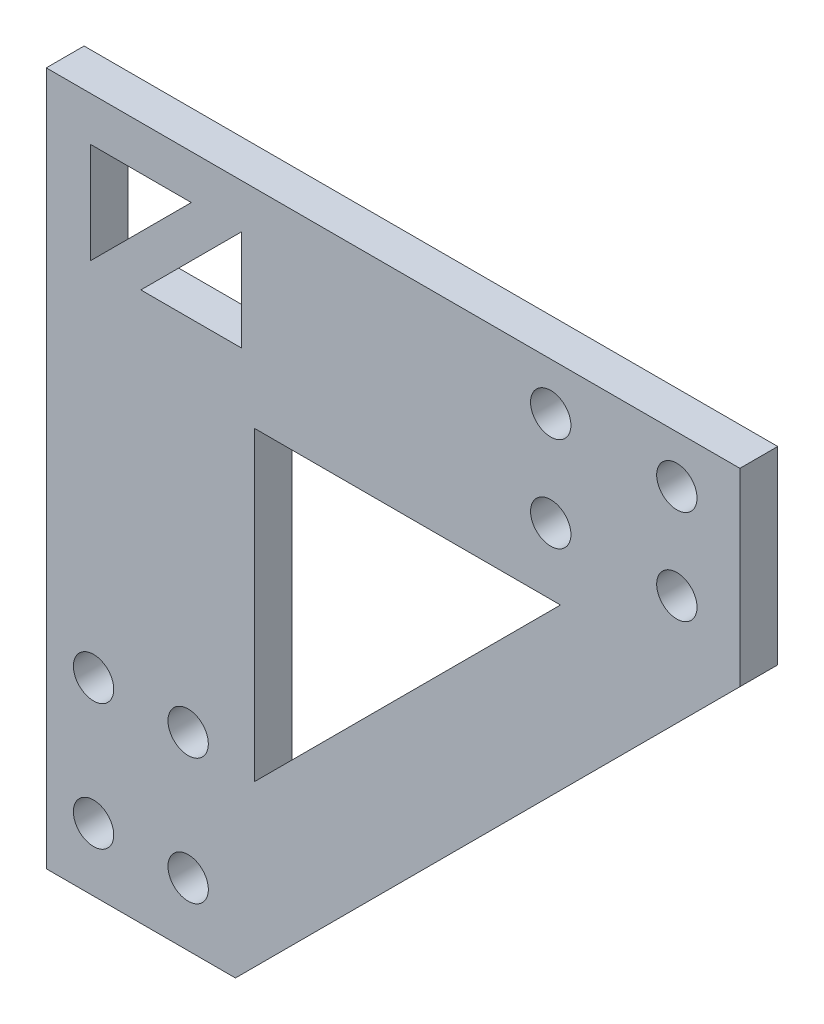
ISO-10303-21;
HEADER;
FILE_DESCRIPTION(('STEP AP214'),'2;1');
FILE_NAME('part.step','',(''),(''),'','','');
FILE_SCHEMA(('AUTOMOTIVE_DESIGN { 1 0 10303 214 1 1 1 1 }'));
ENDSEC;
DATA;
#1=APPLICATION_CONTEXT('core data for automotive mechanical design processes');
#2=APPLICATION_PROTOCOL_DEFINITION('international standard','automotive_design',2000,#1);
#3=PRODUCT_CONTEXT('',#1,'mechanical');
#4=PRODUCT('Part','Part','',(#3));
#5=PRODUCT_RELATED_PRODUCT_CATEGORY('part','',(#4));
#6=PRODUCT_DEFINITION_FORMATION('','',#4);
#7=PRODUCT_DEFINITION_CONTEXT('part definition',#1,'design');
#8=PRODUCT_DEFINITION('design','',#6,#7);
#9=PRODUCT_DEFINITION_SHAPE('','',#8);
#10=(LENGTH_UNIT() NAMED_UNIT(*) SI_UNIT(.MILLI.,.METRE.));
#11=(NAMED_UNIT(*) PLANE_ANGLE_UNIT() SI_UNIT($,.RADIAN.));
#12=(NAMED_UNIT(*) SI_UNIT($,.STERADIAN.) SOLID_ANGLE_UNIT());
#13=UNCERTAINTY_MEASURE_WITH_UNIT(LENGTH_MEASURE(1.E-05),#10,'distance_accuracy_value','');
#14=(GEOMETRIC_REPRESENTATION_CONTEXT(3) GLOBAL_UNCERTAINTY_ASSIGNED_CONTEXT((#13)) GLOBAL_UNIT_ASSIGNED_CONTEXT((#10,
#11,#12)) REPRESENTATION_CONTEXT('',''));
#15=CARTESIAN_POINT('',(0.,0.,0.));
#16=DIRECTION('',(0.,0.,1.));
#17=DIRECTION('',(1.,0.,0.));
#18=AXIS2_PLACEMENT_3D('',#15,#16,#17);
#19=CARTESIAN_POINT('',(0.,0.,3.));
#20=DIRECTION('',(0.,0.,-1.));
#21=DIRECTION('',(-1.,0.,0.));
#22=AXIS2_PLACEMENT_3D('',#19,#20,#21);
#23=PLANE('',#22);
#24=DIRECTION('',(0.,-1.,0.));
#25=VECTOR('',#24,1.);
#26=CARTESIAN_POINT('',(3.49999999999999,-3.5,3.));
#27=LINE('',#26,#25);
#28=CARTESIAN_POINT('',(3.49999999999999,-3.5,3.));
#29=VERTEX_POINT('',#28);
#30=CARTESIAN_POINT('',(3.5,-11.5,3.));
#31=VERTEX_POINT('',#30);
#32=EDGE_CURVE('E181',#29,#31,#27,.T.);
#33=ORIENTED_EDGE('',*,*,#32,.F.);
#34=DIRECTION('',(-1.,0.,0.));
#35=VECTOR('',#34,1.);
#36=CARTESIAN_POINT('',(3.49999999999999,-3.5,3.));
#37=LINE('',#36,#35);
#38=CARTESIAN_POINT('',(11.5,-3.5,3.));
#39=VERTEX_POINT('',#38);
#40=EDGE_CURVE('E189',#39,#29,#37,.T.);
#41=ORIENTED_EDGE('',*,*,#40,.F.);
#42=DIRECTION('',(0.707106781186547,0.707106781186548,0.));
#43=VECTOR('',#42,1.);
#44=CARTESIAN_POINT('',(11.5,-3.5,3.));
#45=LINE('',#44,#43);
#46=EDGE_CURVE('E184',#31,#39,#45,.T.);
#47=ORIENTED_EDGE('',*,*,#46,.F.);
#48=EDGE_LOOP('',(#33,#41,#47));
#49=FACE_BOUND('',#48,.T.);
#50=CARTESIAN_POINT('',(40.,-3.75,3.));
#51=DIRECTION('',(0.,0.,1.));
#52=DIRECTION('',(-1.,0.,0.));
#53=AXIS2_PLACEMENT_3D('',#50,#51,#52);
#54=CIRCLE('',#53,1.6);
#55=CARTESIAN_POINT('',(38.4,-3.75,3.));
#56=VERTEX_POINT('',#55);
#57=EDGE_CURVE('E247',#56,#56,#54,.T.);
#58=ORIENTED_EDGE('',*,*,#57,.F.);
#59=EDGE_LOOP('',(#58));
#60=FACE_BOUND('',#59,.T.);
#61=CARTESIAN_POINT('',(40.,-11.25,3.));
#62=DIRECTION('',(0.,0.,1.));
#63=DIRECTION('',(1.,0.,0.));
#64=AXIS2_PLACEMENT_3D('',#61,#62,#63);
#65=CIRCLE('',#64,1.6);
#66=CARTESIAN_POINT('',(41.6,-11.25,3.));
#67=VERTEX_POINT('',#66);
#68=EDGE_CURVE('E255',#67,#67,#65,.T.);
#69=ORIENTED_EDGE('',*,*,#68,.F.);
#70=EDGE_LOOP('',(#69));
#71=FACE_BOUND('',#70,.T.);
#72=CARTESIAN_POINT('',(50.,-11.25,3.));
#73=DIRECTION('',(0.,0.,1.));
#74=DIRECTION('',(-1.,0.,0.));
#75=AXIS2_PLACEMENT_3D('',#72,#73,#74);
#76=CIRCLE('',#75,1.6);
#77=CARTESIAN_POINT('',(48.4,-11.25,3.));
#78=VERTEX_POINT('',#77);
#79=EDGE_CURVE('E263',#78,#78,#76,.T.);
#80=ORIENTED_EDGE('',*,*,#79,.F.);
#81=EDGE_LOOP('',(#80));
#82=FACE_BOUND('',#81,.T.);
#83=CARTESIAN_POINT('',(50.,-3.75,3.));
#84=DIRECTION('',(0.,0.,1.));
#85=DIRECTION('',(1.,0.,0.));
#86=AXIS2_PLACEMENT_3D('',#83,#84,#85);
#87=CIRCLE('',#86,1.6);
#88=CARTESIAN_POINT('',(51.6,-3.75,3.));
#89=VERTEX_POINT('',#88);
#90=EDGE_CURVE('E271',#89,#89,#87,.T.);
#91=ORIENTED_EDGE('',*,*,#90,.F.);
#92=EDGE_LOOP('',(#91));
#93=FACE_BOUND('',#92,.T.);
#94=CARTESIAN_POINT('',(3.75000000000001,-40.,3.));
#95=DIRECTION('',(0.,0.,1.));
#96=DIRECTION('',(-1.,0.,0.));
#97=AXIS2_PLACEMENT_3D('',#94,#95,#96);
#98=CIRCLE('',#97,1.6);
#99=CARTESIAN_POINT('',(2.15000000000002,-40.,3.));
#100=VERTEX_POINT('',#99);
#101=EDGE_CURVE('E279',#100,#100,#98,.T.);
#102=ORIENTED_EDGE('',*,*,#101,.F.);
#103=EDGE_LOOP('',(#102));
#104=FACE_BOUND('',#103,.T.);
#105=CARTESIAN_POINT('',(11.25,-40.,3.));
#106=DIRECTION('',(0.,0.,1.));
#107=DIRECTION('',(1.,0.,0.));
#108=AXIS2_PLACEMENT_3D('',#105,#106,#107);
#109=CIRCLE('',#108,1.6);
#110=CARTESIAN_POINT('',(12.85,-40.,3.));
#111=VERTEX_POINT('',#110);
#112=EDGE_CURVE('E287',#111,#111,#109,.T.);
#113=ORIENTED_EDGE('',*,*,#112,.F.);
#114=EDGE_LOOP('',(#113));
#115=FACE_BOUND('',#114,.T.);
#116=CARTESIAN_POINT('',(11.25,-50.,3.));
#117=DIRECTION('',(0.,0.,1.));
#118=DIRECTION('',(-1.,0.,0.));
#119=AXIS2_PLACEMENT_3D('',#116,#117,#118);
#120=CIRCLE('',#119,1.6);
#121=CARTESIAN_POINT('',(9.65000000000002,-50.,3.));
#122=VERTEX_POINT('',#121);
#123=EDGE_CURVE('E295',#122,#122,#120,.T.);
#124=ORIENTED_EDGE('',*,*,#123,.F.);
#125=EDGE_LOOP('',(#124));
#126=FACE_BOUND('',#125,.T.);
#127=CARTESIAN_POINT('',(3.75000000000001,-50.,3.));
#128=DIRECTION('',(0.,0.,1.));
#129=DIRECTION('',(1.,0.,0.));
#130=AXIS2_PLACEMENT_3D('',#127,#128,#129);
#131=CIRCLE('',#130,1.6);
#132=CARTESIAN_POINT('',(5.35000000000001,-50.,3.));
#133=VERTEX_POINT('',#132);
#134=EDGE_CURVE('E303',#133,#133,#131,.T.);
#135=ORIENTED_EDGE('',*,*,#134,.F.);
#136=EDGE_LOOP('',(#135));
#137=FACE_BOUND('',#136,.T.);
#138=DIRECTION('',(0.,-1.,0.));
#139=VECTOR('',#138,1.);
#140=CARTESIAN_POINT('',(0.,-55.,3.));
#141=LINE('',#140,#139);
#142=CARTESIAN_POINT('',(0.,0.,3.));
#143=VERTEX_POINT('',#142);
#144=CARTESIAN_POINT('',(0.,-55.,3.));
#145=VERTEX_POINT('',#144);
#146=EDGE_CURVE('E311',#143,#145,#141,.T.);
#147=ORIENTED_EDGE('',*,*,#146,.T.);
#148=DIRECTION('',(1.,0.,0.));
#149=VECTOR('',#148,1.);
#150=CARTESIAN_POINT('',(15.,-55.,3.));
#151=LINE('',#150,#149);
#152=CARTESIAN_POINT('',(15.,-55.,3.));
#153=VERTEX_POINT('',#152);
#154=EDGE_CURVE('E315',#145,#153,#151,.T.);
#155=ORIENTED_EDGE('',*,*,#154,.T.);
#156=DIRECTION('',(0.707106781186547,0.707106781186548,0.));
#157=VECTOR('',#156,1.);
#158=CARTESIAN_POINT('',(55.,-15.,3.));
#159=LINE('',#158,#157);
#160=CARTESIAN_POINT('',(55.,-15.,3.));
#161=VERTEX_POINT('',#160);
#162=EDGE_CURVE('E319',#153,#161,#159,.T.);
#163=ORIENTED_EDGE('',*,*,#162,.T.);
#164=DIRECTION('',(0.,1.,0.));
#165=VECTOR('',#164,1.);
#166=CARTESIAN_POINT('',(55.,0.,3.));
#167=LINE('',#166,#165);
#168=CARTESIAN_POINT('',(55.,0.,3.));
#169=VERTEX_POINT('',#168);
#170=EDGE_CURVE('E322',#161,#169,#167,.T.);
#171=ORIENTED_EDGE('',*,*,#170,.T.);
#172=DIRECTION('',(-1.,0.,0.));
#173=VECTOR('',#172,1.);
#174=CARTESIAN_POINT('',(0.,0.,3.));
#175=LINE('',#174,#173);
#176=EDGE_CURVE('E325',#169,#143,#175,.T.);
#177=ORIENTED_EDGE('',*,*,#176,.T.);
#178=EDGE_LOOP('',(#147,#155,#163,#171,#177));
#179=FACE_BOUND('',#178,.T.);
#180=DIRECTION('',(-1.,0.,0.));
#181=VECTOR('',#180,1.);
#182=CARTESIAN_POINT('',(40.7720779386421,-16.5,3.));
#183=LINE('',#182,#181);
#184=CARTESIAN_POINT('',(40.7720779386421,-16.5,3.));
#185=VERTEX_POINT('',#184);
#186=CARTESIAN_POINT('',(16.5,-16.5,3.));
#187=VERTEX_POINT('',#186);
#188=EDGE_CURVE('E214',#185,#187,#183,.T.);
#189=ORIENTED_EDGE('',*,*,#188,.F.);
#190=DIRECTION('',(0.707106781186547,0.707106781186548,0.));
#191=VECTOR('',#190,1.);
#192=CARTESIAN_POINT('',(16.5,-40.7720779386422,3.));
#193=LINE('',#192,#191);
#194=CARTESIAN_POINT('',(16.5,-40.7720779386422,3.));
#195=VERTEX_POINT('',#194);
#196=EDGE_CURVE('E222',#195,#185,#193,.T.);
#197=ORIENTED_EDGE('',*,*,#196,.F.);
#198=DIRECTION('',(0.,-1.,0.));
#199=VECTOR('',#198,1.);
#200=CARTESIAN_POINT('',(16.5,-16.5,3.));
#201=LINE('',#200,#199);
#202=EDGE_CURVE('E217',#187,#195,#201,.T.);
#203=ORIENTED_EDGE('',*,*,#202,.F.);
#204=EDGE_LOOP('',(#189,#197,#203));
#205=FACE_BOUND('',#204,.T.);
#206=DIRECTION('',(0.,1.,0.));
#207=VECTOR('',#206,1.);
#208=CARTESIAN_POINT('',(15.5,-11.5,3.));
#209=LINE('',#208,#207);
#210=CARTESIAN_POINT('',(15.5,-11.5,3.));
#211=VERTEX_POINT('',#210);
#212=CARTESIAN_POINT('',(15.5,-3.5,3.));
#213=VERTEX_POINT('',#212);
#214=EDGE_CURVE('E145',#211,#213,#209,.T.);
#215=ORIENTED_EDGE('',*,*,#214,.F.);
#216=DIRECTION('',(1.,0.,0.));
#217=VECTOR('',#216,1.);
#218=CARTESIAN_POINT('',(7.5,-11.5,3.));
#219=LINE('',#218,#217);
#220=CARTESIAN_POINT('',(7.5,-11.5,3.));
#221=VERTEX_POINT('',#220);
#222=EDGE_CURVE('E164',#221,#211,#219,.T.);
#223=ORIENTED_EDGE('',*,*,#222,.F.);
#224=DIRECTION('',(-0.707106781186547,-0.707106781186548,0.));
#225=VECTOR('',#224,1.);
#226=CARTESIAN_POINT('',(15.5,-3.5,3.));
#227=LINE('',#226,#225);
#228=EDGE_CURVE('E154',#213,#221,#227,.T.);
#229=ORIENTED_EDGE('',*,*,#228,.F.);
#230=EDGE_LOOP('',(#215,#223,#229));
#231=FACE_BOUND('',#230,.T.);
#232=ADVANCED_FACE('F43',(#49,#60,#71,#82,#93,#104,#115,#126,#137,#179,#205,#231),#23,.F.);
#233=CARTESIAN_POINT('',(0.,0.,0.));
#234=DIRECTION('',(0.,0.,-1.));
#235=DIRECTION('',(-1.,0.,0.));
#236=AXIS2_PLACEMENT_3D('',#233,#234,#235);
#237=PLANE('',#236);
#238=CARTESIAN_POINT('',(40.,-11.25,0.));
#239=DIRECTION('',(0.,0.,1.));
#240=DIRECTION('',(1.,0.,0.));
#241=AXIS2_PLACEMENT_3D('',#238,#239,#240);
#242=CIRCLE('',#241,1.6);
#243=CARTESIAN_POINT('',(41.6,-11.25,0.));
#244=VERTEX_POINT('',#243);
#245=EDGE_CURVE('E251',#244,#244,#242,.T.);
#246=ORIENTED_EDGE('',*,*,#245,.T.);
#247=EDGE_LOOP('',(#246));
#248=FACE_BOUND('',#247,.T.);
#249=CARTESIAN_POINT('',(50.,-3.75,0.));
#250=DIRECTION('',(0.,0.,1.));
#251=DIRECTION('',(1.,0.,0.));
#252=AXIS2_PLACEMENT_3D('',#249,#250,#251);
#253=CIRCLE('',#252,1.6);
#254=CARTESIAN_POINT('',(51.6,-3.75,0.));
#255=VERTEX_POINT('',#254);
#256=EDGE_CURVE('E267',#255,#255,#253,.T.);
#257=ORIENTED_EDGE('',*,*,#256,.T.);
#258=EDGE_LOOP('',(#257));
#259=FACE_BOUND('',#258,.T.);
#260=CARTESIAN_POINT('',(11.25,-40.,0.));
#261=DIRECTION('',(0.,0.,1.));
#262=DIRECTION('',(1.,0.,0.));
#263=AXIS2_PLACEMENT_3D('',#260,#261,#262);
#264=CIRCLE('',#263,1.6);
#265=CARTESIAN_POINT('',(12.85,-40.,0.));
#266=VERTEX_POINT('',#265);
#267=EDGE_CURVE('E283',#266,#266,#264,.T.);
#268=ORIENTED_EDGE('',*,*,#267,.T.);
#269=EDGE_LOOP('',(#268));
#270=FACE_BOUND('',#269,.T.);
#271=CARTESIAN_POINT('',(3.75000000000001,-50.,0.));
#272=DIRECTION('',(0.,0.,1.));
#273=DIRECTION('',(1.,0.,0.));
#274=AXIS2_PLACEMENT_3D('',#271,#272,#273);
#275=CIRCLE('',#274,1.6);
#276=CARTESIAN_POINT('',(5.35000000000001,-50.,0.));
#277=VERTEX_POINT('',#276);
#278=EDGE_CURVE('E299',#277,#277,#275,.T.);
#279=ORIENTED_EDGE('',*,*,#278,.T.);
#280=EDGE_LOOP('',(#279));
#281=FACE_BOUND('',#280,.T.);
#282=DIRECTION('',(0.,-1.,0.));
#283=VECTOR('',#282,1.);
#284=CARTESIAN_POINT('',(0.,-55.,0.));
#285=LINE('',#284,#283);
#286=CARTESIAN_POINT('',(0.,0.,0.));
#287=VERTEX_POINT('',#286);
#288=CARTESIAN_POINT('',(0.,-55.,0.));
#289=VERTEX_POINT('',#288);
#290=EDGE_CURVE('E307',#287,#289,#285,.T.);
#291=ORIENTED_EDGE('',*,*,#290,.F.);
#292=DIRECTION('',(-1.,0.,0.));
#293=VECTOR('',#292,1.);
#294=CARTESIAN_POINT('',(0.,0.,0.));
#295=LINE('',#294,#293);
#296=CARTESIAN_POINT('',(55.,0.,0.));
#297=VERTEX_POINT('',#296);
#298=EDGE_CURVE('E316',#297,#287,#295,.T.);
#299=ORIENTED_EDGE('',*,*,#298,.F.);
#300=DIRECTION('',(0.,1.,0.));
#301=VECTOR('',#300,1.);
#302=CARTESIAN_POINT('',(55.,0.,0.));
#303=LINE('',#302,#301);
#304=CARTESIAN_POINT('',(55.,-15.,0.));
#305=VERTEX_POINT('',#304);
#306=EDGE_CURVE('E338',#305,#297,#303,.T.);
#307=ORIENTED_EDGE('',*,*,#306,.F.);
#308=DIRECTION('',(0.707106781186547,0.707106781186548,0.));
#309=VECTOR('',#308,1.);
#310=CARTESIAN_POINT('',(55.,-15.,0.));
#311=LINE('',#310,#309);
#312=CARTESIAN_POINT('',(15.,-55.,0.));
#313=VERTEX_POINT('',#312);
#314=EDGE_CURVE('E335',#313,#305,#311,.T.);
#315=ORIENTED_EDGE('',*,*,#314,.F.);
#316=DIRECTION('',(1.,0.,0.));
#317=VECTOR('',#316,1.);
#318=CARTESIAN_POINT('',(15.,-55.,0.));
#319=LINE('',#318,#317);
#320=EDGE_CURVE('E332',#289,#313,#319,.T.);
#321=ORIENTED_EDGE('',*,*,#320,.F.);
#322=EDGE_LOOP('',(#291,#299,#307,#315,#321));
#323=FACE_BOUND('',#322,.T.);
#324=CARTESIAN_POINT('',(11.25,-50.,0.));
#325=DIRECTION('',(0.,0.,1.));
#326=DIRECTION('',(-1.,0.,0.));
#327=AXIS2_PLACEMENT_3D('',#324,#325,#326);
#328=CIRCLE('',#327,1.6);
#329=CARTESIAN_POINT('',(9.65000000000002,-50.,0.));
#330=VERTEX_POINT('',#329);
#331=EDGE_CURVE('E291',#330,#330,#328,.T.);
#332=ORIENTED_EDGE('',*,*,#331,.T.);
#333=EDGE_LOOP('',(#332));
#334=FACE_BOUND('',#333,.T.);
#335=CARTESIAN_POINT('',(3.75000000000001,-40.,0.));
#336=DIRECTION('',(0.,0.,1.));
#337=DIRECTION('',(-1.,0.,0.));
#338=AXIS2_PLACEMENT_3D('',#335,#336,#337);
#339=CIRCLE('',#338,1.6);
#340=CARTESIAN_POINT('',(2.15000000000002,-40.,0.));
#341=VERTEX_POINT('',#340);
#342=EDGE_CURVE('E275',#341,#341,#339,.T.);
#343=ORIENTED_EDGE('',*,*,#342,.T.);
#344=EDGE_LOOP('',(#343));
#345=FACE_BOUND('',#344,.T.);
#346=CARTESIAN_POINT('',(50.,-11.25,0.));
#347=DIRECTION('',(0.,0.,1.));
#348=DIRECTION('',(-1.,0.,0.));
#349=AXIS2_PLACEMENT_3D('',#346,#347,#348);
#350=CIRCLE('',#349,1.6);
#351=CARTESIAN_POINT('',(48.4,-11.25,0.));
#352=VERTEX_POINT('',#351);
#353=EDGE_CURVE('E259',#352,#352,#350,.T.);
#354=ORIENTED_EDGE('',*,*,#353,.T.);
#355=EDGE_LOOP('',(#354));
#356=FACE_BOUND('',#355,.T.);
#357=CARTESIAN_POINT('',(40.,-3.75,0.));
#358=DIRECTION('',(0.,0.,1.));
#359=DIRECTION('',(-1.,0.,0.));
#360=AXIS2_PLACEMENT_3D('',#357,#358,#359);
#361=CIRCLE('',#360,1.6);
#362=CARTESIAN_POINT('',(38.4,-3.75,0.));
#363=VERTEX_POINT('',#362);
#364=EDGE_CURVE('E246',#363,#363,#361,.T.);
#365=ORIENTED_EDGE('',*,*,#364,.T.);
#366=EDGE_LOOP('',(#365));
#367=FACE_BOUND('',#366,.T.);
#368=DIRECTION('',(0.707106781186547,0.707106781186548,0.));
#369=VECTOR('',#368,1.);
#370=CARTESIAN_POINT('',(16.5,-40.7720779386422,0.));
#371=LINE('',#370,#369);
#372=CARTESIAN_POINT('',(16.5,-40.7720779386422,0.));
#373=VERTEX_POINT('',#372);
#374=CARTESIAN_POINT('',(40.7720779386421,-16.5,0.));
#375=VERTEX_POINT('',#374);
#376=EDGE_CURVE('E218',#373,#375,#371,.T.);
#377=ORIENTED_EDGE('',*,*,#376,.T.);
#378=DIRECTION('',(-1.,0.,0.));
#379=VECTOR('',#378,1.);
#380=CARTESIAN_POINT('',(40.7720779386421,-16.5,0.));
#381=LINE('',#380,#379);
#382=CARTESIAN_POINT('',(16.5,-16.5,0.));
#383=VERTEX_POINT('',#382);
#384=EDGE_CURVE('E213',#375,#383,#381,.T.);
#385=ORIENTED_EDGE('',*,*,#384,.T.);
#386=DIRECTION('',(0.,-1.,0.));
#387=VECTOR('',#386,1.);
#388=CARTESIAN_POINT('',(16.5,-16.5,0.));
#389=LINE('',#388,#387);
#390=EDGE_CURVE('E229',#383,#373,#389,.T.);
#391=ORIENTED_EDGE('',*,*,#390,.T.);
#392=EDGE_LOOP('',(#377,#385,#391));
#393=FACE_BOUND('',#392,.T.);
#394=DIRECTION('',(-1.,0.,0.));
#395=VECTOR('',#394,1.);
#396=CARTESIAN_POINT('',(3.49999999999999,-3.5,0.));
#397=LINE('',#396,#395);
#398=CARTESIAN_POINT('',(11.5,-3.5,0.));
#399=VERTEX_POINT('',#398);
#400=CARTESIAN_POINT('',(3.49999999999999,-3.5,0.));
#401=VERTEX_POINT('',#400);
#402=EDGE_CURVE('E185',#399,#401,#397,.T.);
#403=ORIENTED_EDGE('',*,*,#402,.T.);
#404=DIRECTION('',(0.,-1.,0.));
#405=VECTOR('',#404,1.);
#406=CARTESIAN_POINT('',(3.49999999999999,-3.5,0.));
#407=LINE('',#406,#405);
#408=CARTESIAN_POINT('',(3.5,-11.5,0.));
#409=VERTEX_POINT('',#408);
#410=EDGE_CURVE('E162',#401,#409,#407,.T.);
#411=ORIENTED_EDGE('',*,*,#410,.T.);
#412=DIRECTION('',(0.707106781186547,0.707106781186548,0.));
#413=VECTOR('',#412,1.);
#414=CARTESIAN_POINT('',(11.5,-3.5,0.));
#415=LINE('',#414,#413);
#416=EDGE_CURVE('E196',#409,#399,#415,.T.);
#417=ORIENTED_EDGE('',*,*,#416,.T.);
#418=EDGE_LOOP('',(#403,#411,#417));
#419=FACE_BOUND('',#418,.T.);
#420=DIRECTION('',(1.,0.,0.));
#421=VECTOR('',#420,1.);
#422=CARTESIAN_POINT('',(7.5,-11.5,0.));
#423=LINE('',#422,#421);
#424=CARTESIAN_POINT('',(7.5,-11.5,0.));
#425=VERTEX_POINT('',#424);
#426=CARTESIAN_POINT('',(15.5,-11.5,0.));
#427=VERTEX_POINT('',#426);
#428=EDGE_CURVE('E155',#425,#427,#423,.T.);
#429=ORIENTED_EDGE('',*,*,#428,.T.);
#430=DIRECTION('',(0.,1.,0.));
#431=VECTOR('',#430,1.);
#432=CARTESIAN_POINT('',(15.5,-11.5,0.));
#433=LINE('',#432,#431);
#434=CARTESIAN_POINT('',(15.5,-3.5,0.));
#435=VERTEX_POINT('',#434);
#436=EDGE_CURVE('E67',#427,#435,#433,.T.);
#437=ORIENTED_EDGE('',*,*,#436,.T.);
#438=DIRECTION('',(-0.707106781186547,-0.707106781186548,0.));
#439=VECTOR('',#438,1.);
#440=CARTESIAN_POINT('',(15.5,-3.5,0.));
#441=LINE('',#440,#439);
#442=EDGE_CURVE('E160',#435,#425,#441,.T.);
#443=ORIENTED_EDGE('',*,*,#442,.T.);
#444=EDGE_LOOP('',(#429,#437,#443));
#445=FACE_BOUND('',#444,.T.);
#446=ADVANCED_FACE('F365',(#248,#259,#270,#281,#323,#334,#345,#356,#367,#393,#419,#445),#237,.T.);
#447=CARTESIAN_POINT('',(0.,-55.,3.));
#448=DIRECTION('',(1.,0.,0.));
#449=DIRECTION('',(0.,1.,0.));
#450=AXIS2_PLACEMENT_3D('',#447,#448,#449);
#451=PLANE('',#450);
#452=ORIENTED_EDGE('',*,*,#290,.T.);
#453=DIRECTION('',(0.,0.,-1.));
#454=VECTOR('',#453,1.);
#455=CARTESIAN_POINT('',(0.,-55.,3.));
#456=LINE('',#455,#454);
#457=EDGE_CURVE('E11',#145,#289,#456,.T.);
#458=ORIENTED_EDGE('',*,*,#457,.F.);
#459=ORIENTED_EDGE('',*,*,#146,.F.);
#460=DIRECTION('',(0.,0.,-1.));
#461=VECTOR('',#460,1.);
#462=CARTESIAN_POINT('',(0.,0.,3.));
#463=LINE('',#462,#461);
#464=EDGE_CURVE('E328',#143,#287,#463,.T.);
#465=ORIENTED_EDGE('',*,*,#464,.T.);
#466=EDGE_LOOP('',(#452,#458,#459,#465));
#467=FACE_BOUND('',#466,.T.);
#468=ADVANCED_FACE('F45',(#467),#451,.F.);
#469=CARTESIAN_POINT('',(15.,-55.,3.));
#470=DIRECTION('',(0.,1.,0.));
#471=DIRECTION('',(-1.,0.,0.));
#472=AXIS2_PLACEMENT_3D('',#469,#470,#471);
#473=PLANE('',#472);
#474=ORIENTED_EDGE('',*,*,#320,.T.);
#475=DIRECTION('',(0.,0.,-1.));
#476=VECTOR('',#475,1.);
#477=CARTESIAN_POINT('',(15.,-55.,3.));
#478=LINE('',#477,#476);
#479=EDGE_CURVE('E52',#153,#313,#478,.T.);
#480=ORIENTED_EDGE('',*,*,#479,.F.);
#481=ORIENTED_EDGE('',*,*,#154,.F.);
#482=ORIENTED_EDGE('',*,*,#457,.T.);
#483=EDGE_LOOP('',(#474,#480,#481,#482));
#484=FACE_BOUND('',#483,.T.);
#485=ADVANCED_FACE('F380',(#484),#473,.F.);
#486=CARTESIAN_POINT('',(55.,-15.,3.));
#487=DIRECTION('',(-0.707106781186548,0.707106781186547,0.));
#488=DIRECTION('',(-0.707106781186547,-0.707106781186548,0.));
#489=AXIS2_PLACEMENT_3D('',#486,#487,#488);
#490=PLANE('',#489);
#491=ORIENTED_EDGE('',*,*,#314,.T.);
#492=DIRECTION('',(0.,0.,-1.));
#493=VECTOR('',#492,1.);
#494=CARTESIAN_POINT('',(55.,-15.,3.));
#495=LINE('',#494,#493);
#496=EDGE_CURVE('E350',#161,#305,#495,.T.);
#497=ORIENTED_EDGE('',*,*,#496,.F.);
#498=ORIENTED_EDGE('',*,*,#162,.F.);
#499=ORIENTED_EDGE('',*,*,#479,.T.);
#500=EDGE_LOOP('',(#491,#497,#498,#499));
#501=FACE_BOUND('',#500,.T.);
#502=ADVANCED_FACE('F359',(#501),#490,.F.);
#503=CARTESIAN_POINT('',(55.,0.,3.));
#504=DIRECTION('',(-1.,0.,0.));
#505=DIRECTION('',(0.,0.,1.));
#506=AXIS2_PLACEMENT_3D('',#503,#504,#505);
#507=PLANE('',#506);
#508=ORIENTED_EDGE('',*,*,#306,.T.);
#509=DIRECTION('',(0.,0.,-1.));
#510=VECTOR('',#509,1.);
#511=CARTESIAN_POINT('',(55.,0.,3.));
#512=LINE('',#511,#510);
#513=EDGE_CURVE('E346',#169,#297,#512,.T.);
#514=ORIENTED_EDGE('',*,*,#513,.F.);
#515=ORIENTED_EDGE('',*,*,#170,.F.);
#516=ORIENTED_EDGE('',*,*,#496,.T.);
#517=EDGE_LOOP('',(#508,#514,#515,#516));
#518=FACE_BOUND('',#517,.T.);
#519=ADVANCED_FACE('F370',(#518),#507,.F.);
#520=CARTESIAN_POINT('',(0.,0.,3.));
#521=DIRECTION('',(0.,-1.,0.));
#522=DIRECTION('',(0.,0.,-1.));
#523=AXIS2_PLACEMENT_3D('',#520,#521,#522);
#524=PLANE('',#523);
#525=ORIENTED_EDGE('',*,*,#298,.T.);
#526=ORIENTED_EDGE('',*,*,#464,.F.);
#527=ORIENTED_EDGE('',*,*,#176,.F.);
#528=ORIENTED_EDGE('',*,*,#513,.T.);
#529=EDGE_LOOP('',(#525,#526,#527,#528));
#530=FACE_BOUND('',#529,.T.);
#531=ADVANCED_FACE('F374',(#530),#524,.F.);
#532=CARTESIAN_POINT('',(3.75000000000001,-50.,3.));
#533=DIRECTION('',(0.,0.,-1.));
#534=DIRECTION('',(-1.,0.,0.));
#535=AXIS2_PLACEMENT_3D('',#532,#533,#534);
#536=CYLINDRICAL_SURFACE('',#535,1.6);
#537=ORIENTED_EDGE('',*,*,#134,.T.);
#538=EDGE_LOOP('',(#537));
#539=FACE_BOUND('',#538,.T.);
#540=ORIENTED_EDGE('',*,*,#278,.F.);
#541=EDGE_LOOP('',(#540));
#542=FACE_BOUND('',#541,.T.);
#543=ADVANCED_FACE('F397',(#539,#542),#536,.F.);
#544=CARTESIAN_POINT('',(11.25,-50.,3.));
#545=DIRECTION('',(0.,0.,-1.));
#546=DIRECTION('',(-1.,0.,0.));
#547=AXIS2_PLACEMENT_3D('',#544,#545,#546);
#548=CYLINDRICAL_SURFACE('',#547,1.6);
#549=ORIENTED_EDGE('',*,*,#123,.T.);
#550=EDGE_LOOP('',(#549));
#551=FACE_BOUND('',#550,.T.);
#552=ORIENTED_EDGE('',*,*,#331,.F.);
#553=EDGE_LOOP('',(#552));
#554=FACE_BOUND('',#553,.T.);
#555=ADVANCED_FACE('F423',(#551,#554),#548,.F.);
#556=CARTESIAN_POINT('',(11.25,-40.,3.));
#557=DIRECTION('',(0.,0.,-1.));
#558=DIRECTION('',(-1.,0.,0.));
#559=AXIS2_PLACEMENT_3D('',#556,#557,#558);
#560=CYLINDRICAL_SURFACE('',#559,1.6);
#561=ORIENTED_EDGE('',*,*,#112,.T.);
#562=EDGE_LOOP('',(#561));
#563=FACE_BOUND('',#562,.T.);
#564=ORIENTED_EDGE('',*,*,#267,.F.);
#565=EDGE_LOOP('',(#564));
#566=FACE_BOUND('',#565,.T.);
#567=ADVANCED_FACE('F430',(#563,#566),#560,.F.);
#568=CARTESIAN_POINT('',(3.75000000000001,-40.,3.));
#569=DIRECTION('',(0.,0.,-1.));
#570=DIRECTION('',(-1.,0.,0.));
#571=AXIS2_PLACEMENT_3D('',#568,#569,#570);
#572=CYLINDRICAL_SURFACE('',#571,1.6);
#573=ORIENTED_EDGE('',*,*,#101,.T.);
#574=EDGE_LOOP('',(#573));
#575=FACE_BOUND('',#574,.T.);
#576=ORIENTED_EDGE('',*,*,#342,.F.);
#577=EDGE_LOOP('',(#576));
#578=FACE_BOUND('',#577,.T.);
#579=ADVANCED_FACE('F437',(#575,#578),#572,.F.);
#580=CARTESIAN_POINT('',(50.,-3.75,3.));
#581=DIRECTION('',(0.,0.,-1.));
#582=DIRECTION('',(-1.,0.,0.));
#583=AXIS2_PLACEMENT_3D('',#580,#581,#582);
#584=CYLINDRICAL_SURFACE('',#583,1.6);
#585=ORIENTED_EDGE('',*,*,#90,.T.);
#586=EDGE_LOOP('',(#585));
#587=FACE_BOUND('',#586,.T.);
#588=ORIENTED_EDGE('',*,*,#256,.F.);
#589=EDGE_LOOP('',(#588));
#590=FACE_BOUND('',#589,.T.);
#591=ADVANCED_FACE('F445',(#587,#590),#584,.F.);
#592=CARTESIAN_POINT('',(50.,-11.25,3.));
#593=DIRECTION('',(0.,0.,-1.));
#594=DIRECTION('',(-1.,0.,0.));
#595=AXIS2_PLACEMENT_3D('',#592,#593,#594);
#596=CYLINDRICAL_SURFACE('',#595,1.6);
#597=ORIENTED_EDGE('',*,*,#79,.T.);
#598=EDGE_LOOP('',(#597));
#599=FACE_BOUND('',#598,.T.);
#600=ORIENTED_EDGE('',*,*,#353,.F.);
#601=EDGE_LOOP('',(#600));
#602=FACE_BOUND('',#601,.T.);
#603=ADVANCED_FACE('F453',(#599,#602),#596,.F.);
#604=CARTESIAN_POINT('',(40.,-11.25,3.));
#605=DIRECTION('',(0.,0.,-1.));
#606=DIRECTION('',(-1.,0.,0.));
#607=AXIS2_PLACEMENT_3D('',#604,#605,#606);
#608=CYLINDRICAL_SURFACE('',#607,1.6);
#609=ORIENTED_EDGE('',*,*,#68,.T.);
#610=EDGE_LOOP('',(#609));
#611=FACE_BOUND('',#610,.T.);
#612=ORIENTED_EDGE('',*,*,#245,.F.);
#613=EDGE_LOOP('',(#612));
#614=FACE_BOUND('',#613,.T.);
#615=ADVANCED_FACE('F461',(#611,#614),#608,.F.);
#616=CARTESIAN_POINT('',(40.,-3.75,3.));
#617=DIRECTION('',(0.,0.,-1.));
#618=DIRECTION('',(-1.,0.,0.));
#619=AXIS2_PLACEMENT_3D('',#616,#617,#618);
#620=CYLINDRICAL_SURFACE('',#619,1.6);
#621=ORIENTED_EDGE('',*,*,#57,.T.);
#622=EDGE_LOOP('',(#621));
#623=FACE_BOUND('',#622,.T.);
#624=ORIENTED_EDGE('',*,*,#364,.F.);
#625=EDGE_LOOP('',(#624));
#626=FACE_BOUND('',#625,.T.);
#627=ADVANCED_FACE('F469',(#623,#626),#620,.F.);
#628=CARTESIAN_POINT('',(40.7720779386421,-16.5,3.));
#629=DIRECTION('',(0.,-1.,0.));
#630=DIRECTION('',(1.,0.,0.));
#631=AXIS2_PLACEMENT_3D('',#628,#629,#630);
#632=PLANE('',#631);
#633=ORIENTED_EDGE('',*,*,#384,.F.);
#634=DIRECTION('',(0.,0.,-1.));
#635=VECTOR('',#634,1.);
#636=CARTESIAN_POINT('',(40.7720779386421,-16.5,3.));
#637=LINE('',#636,#635);
#638=EDGE_CURVE('E225',#185,#375,#637,.T.);
#639=ORIENTED_EDGE('',*,*,#638,.F.);
#640=ORIENTED_EDGE('',*,*,#188,.T.);
#641=DIRECTION('',(0.,0.,-1.));
#642=VECTOR('',#641,1.);
#643=CARTESIAN_POINT('',(16.5,-16.5,3.));
#644=LINE('',#643,#642);
#645=EDGE_CURVE('E242',#187,#383,#644,.T.);
#646=ORIENTED_EDGE('',*,*,#645,.T.);
#647=EDGE_LOOP('',(#633,#639,#640,#646));
#648=FACE_BOUND('',#647,.T.);
#649=ADVANCED_FACE('F477',(#648),#632,.T.);
#650=CARTESIAN_POINT('',(16.5,-16.5,3.));
#651=DIRECTION('',(1.,0.,0.));
#652=DIRECTION('',(0.,1.,0.));
#653=AXIS2_PLACEMENT_3D('',#650,#651,#652);
#654=PLANE('',#653);
#655=ORIENTED_EDGE('',*,*,#390,.F.);
#656=ORIENTED_EDGE('',*,*,#645,.F.);
#657=ORIENTED_EDGE('',*,*,#202,.T.);
#658=DIRECTION('',(0.,0.,-1.));
#659=VECTOR('',#658,1.);
#660=CARTESIAN_POINT('',(16.5,-40.7720779386422,3.));
#661=LINE('',#660,#659);
#662=EDGE_CURVE('E239',#195,#373,#661,.T.);
#663=ORIENTED_EDGE('',*,*,#662,.T.);
#664=EDGE_LOOP('',(#655,#656,#657,#663));
#665=FACE_BOUND('',#664,.T.);
#666=ADVANCED_FACE('F485',(#665),#654,.T.);
#667=CARTESIAN_POINT('',(16.5,-40.7720779386422,3.));
#668=DIRECTION('',(-0.707106781186548,0.707106781186547,0.));
#669=DIRECTION('',(-0.707106781186547,-0.707106781186548,0.));
#670=AXIS2_PLACEMENT_3D('',#667,#668,#669);
#671=PLANE('',#670);
#672=ORIENTED_EDGE('',*,*,#376,.F.);
#673=ORIENTED_EDGE('',*,*,#662,.F.);
#674=ORIENTED_EDGE('',*,*,#196,.T.);
#675=ORIENTED_EDGE('',*,*,#638,.T.);
#676=EDGE_LOOP('',(#672,#673,#674,#675));
#677=FACE_BOUND('',#676,.T.);
#678=ADVANCED_FACE('F493',(#677),#671,.T.);
#679=CARTESIAN_POINT('',(3.49999999999999,-3.5,3.));
#680=DIRECTION('',(1.,0.,0.));
#681=DIRECTION('',(0.,1.,0.));
#682=AXIS2_PLACEMENT_3D('',#679,#680,#681);
#683=PLANE('',#682);
#684=ORIENTED_EDGE('',*,*,#410,.F.);
#685=DIRECTION('',(0.,0.,-1.));
#686=VECTOR('',#685,1.);
#687=CARTESIAN_POINT('',(3.49999999999999,-3.5,3.));
#688=LINE('',#687,#686);
#689=EDGE_CURVE('E192',#29,#401,#688,.T.);
#690=ORIENTED_EDGE('',*,*,#689,.F.);
#691=ORIENTED_EDGE('',*,*,#32,.T.);
#692=DIRECTION('',(0.,0.,-1.));
#693=VECTOR('',#692,1.);
#694=CARTESIAN_POINT('',(3.5,-11.5,3.));
#695=LINE('',#694,#693);
#696=EDGE_CURVE('E209',#31,#409,#695,.T.);
#697=ORIENTED_EDGE('',*,*,#696,.T.);
#698=EDGE_LOOP('',(#684,#690,#691,#697));
#699=FACE_BOUND('',#698,.T.);
#700=ADVANCED_FACE('F501',(#699),#683,.T.);
#701=CARTESIAN_POINT('',(11.5,-3.5,3.));
#702=DIRECTION('',(-0.707106781186548,0.707106781186547,0.));
#703=DIRECTION('',(-0.707106781186547,-0.707106781186548,0.));
#704=AXIS2_PLACEMENT_3D('',#701,#702,#703);
#705=PLANE('',#704);
#706=ORIENTED_EDGE('',*,*,#416,.F.);
#707=ORIENTED_EDGE('',*,*,#696,.F.);
#708=ORIENTED_EDGE('',*,*,#46,.T.);
#709=DIRECTION('',(0.,0.,-1.));
#710=VECTOR('',#709,1.);
#711=CARTESIAN_POINT('',(11.5,-3.5,3.));
#712=LINE('',#711,#710);
#713=EDGE_CURVE('E206',#39,#399,#712,.T.);
#714=ORIENTED_EDGE('',*,*,#713,.T.);
#715=EDGE_LOOP('',(#706,#707,#708,#714));
#716=FACE_BOUND('',#715,.T.);
#717=ADVANCED_FACE('F509',(#716),#705,.T.);
#718=CARTESIAN_POINT('',(3.49999999999999,-3.5,3.));
#719=DIRECTION('',(0.,-1.,0.));
#720=DIRECTION('',(1.,0.,0.));
#721=AXIS2_PLACEMENT_3D('',#718,#719,#720);
#722=PLANE('',#721);
#723=ORIENTED_EDGE('',*,*,#402,.F.);
#724=ORIENTED_EDGE('',*,*,#713,.F.);
#725=ORIENTED_EDGE('',*,*,#40,.T.);
#726=ORIENTED_EDGE('',*,*,#689,.T.);
#727=EDGE_LOOP('',(#723,#724,#725,#726));
#728=FACE_BOUND('',#727,.T.);
#729=ADVANCED_FACE('F517',(#728),#722,.T.);
#730=CARTESIAN_POINT('',(15.5,-11.5,3.));
#731=DIRECTION('',(-1.,0.,0.));
#732=DIRECTION('',(0.,0.,1.));
#733=AXIS2_PLACEMENT_3D('',#730,#731,#732);
#734=PLANE('',#733);
#735=ORIENTED_EDGE('',*,*,#436,.F.);
#736=DIRECTION('',(0.,0.,-1.));
#737=VECTOR('',#736,1.);
#738=CARTESIAN_POINT('',(15.5,-11.5,3.));
#739=LINE('',#738,#737);
#740=EDGE_CURVE('E149',#211,#427,#739,.T.);
#741=ORIENTED_EDGE('',*,*,#740,.F.);
#742=ORIENTED_EDGE('',*,*,#214,.T.);
#743=DIRECTION('',(0.,0.,-1.));
#744=VECTOR('',#743,1.);
#745=CARTESIAN_POINT('',(15.5,-3.5,3.));
#746=LINE('',#745,#744);
#747=EDGE_CURVE('E148',#213,#435,#746,.T.);
#748=ORIENTED_EDGE('',*,*,#747,.T.);
#749=EDGE_LOOP('',(#735,#741,#742,#748));
#750=FACE_BOUND('',#749,.T.);
#751=ADVANCED_FACE('F147',(#750),#734,.T.);
#752=CARTESIAN_POINT('',(15.5,-3.5,3.));
#753=DIRECTION('',(0.707106781186548,-0.707106781186547,0.));
#754=DIRECTION('',(0.707106781186547,0.707106781186548,0.));
#755=AXIS2_PLACEMENT_3D('',#752,#753,#754);
#756=PLANE('',#755);
#757=ORIENTED_EDGE('',*,*,#442,.F.);
#758=ORIENTED_EDGE('',*,*,#747,.F.);
#759=ORIENTED_EDGE('',*,*,#228,.T.);
#760=DIRECTION('',(0.,0.,-1.));
#761=VECTOR('',#760,1.);
#762=CARTESIAN_POINT('',(7.5,-11.5,3.));
#763=LINE('',#762,#761);
#764=EDGE_CURVE('E59',#221,#425,#763,.T.);
#765=ORIENTED_EDGE('',*,*,#764,.T.);
#766=EDGE_LOOP('',(#757,#758,#759,#765));
#767=FACE_BOUND('',#766,.T.);
#768=ADVANCED_FACE('F158',(#767),#756,.T.);
#769=CARTESIAN_POINT('',(7.5,-11.5,3.));
#770=DIRECTION('',(0.,1.,0.));
#771=DIRECTION('',(0.,0.,1.));
#772=AXIS2_PLACEMENT_3D('',#769,#770,#771);
#773=PLANE('',#772);
#774=ORIENTED_EDGE('',*,*,#428,.F.);
#775=ORIENTED_EDGE('',*,*,#764,.F.);
#776=ORIENTED_EDGE('',*,*,#222,.T.);
#777=ORIENTED_EDGE('',*,*,#740,.T.);
#778=EDGE_LOOP('',(#774,#775,#776,#777));
#779=FACE_BOUND('',#778,.T.);
#780=ADVANCED_FACE('F538',(#779),#773,.T.);
#781=CLOSED_SHELL('',(#232,#446,#468,#485,#502,#519,#531,#543,#555,#567,#579,#591,#603,#615,
#627,#649,#666,#678,#700,#717,#729,#751,#768,#780));
#782=MANIFOLD_SOLID_BREP('B2',#781);
#783=ADVANCED_BREP_SHAPE_REPRESENTATION('',(#18,#782),#14);
#784=SHAPE_DEFINITION_REPRESENTATION(#9,#783);
ENDSEC;
END-ISO-10303-21;
